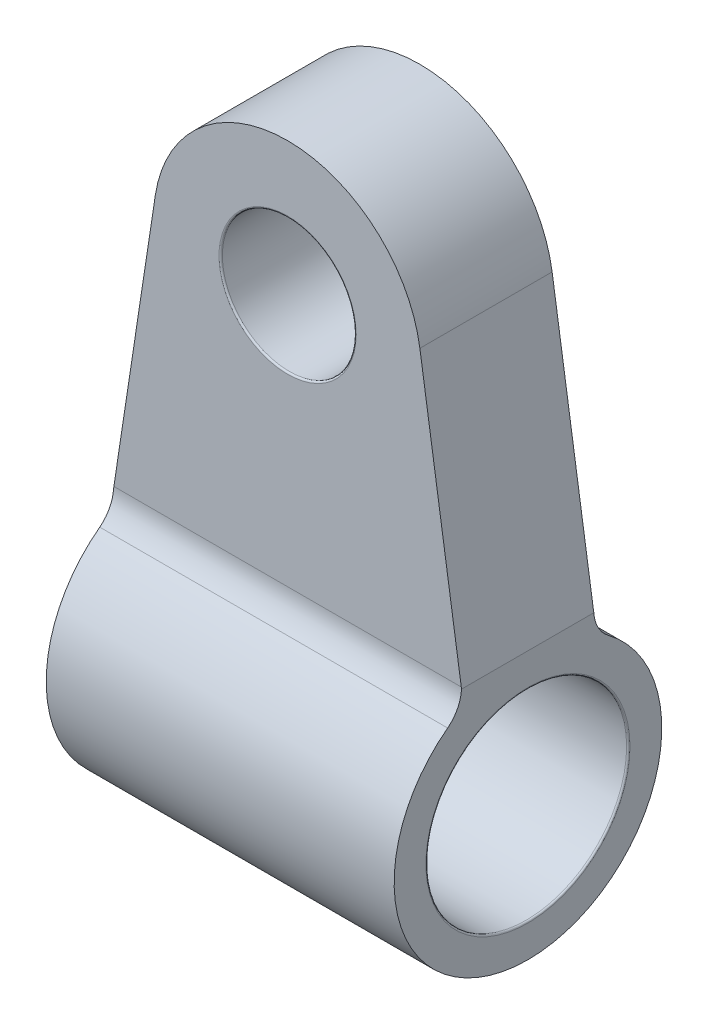
ISO-10303-21;
HEADER;
FILE_DESCRIPTION(('STEP AP214'),'2;1');
FILE_NAME('part.step','',(''),(''),'','','');
FILE_SCHEMA(('AUTOMOTIVE_DESIGN { 1 0 10303 214 1 1 1 1 }'));
ENDSEC;
DATA;
#1=APPLICATION_CONTEXT('core data for automotive mechanical design processes');
#2=APPLICATION_PROTOCOL_DEFINITION('international standard','automotive_design',2000,#1);
#3=PRODUCT_CONTEXT('',#1,'mechanical');
#4=PRODUCT('Part','Part','',(#3));
#5=PRODUCT_RELATED_PRODUCT_CATEGORY('part','',(#4));
#6=PRODUCT_DEFINITION_FORMATION('','',#4);
#7=PRODUCT_DEFINITION_CONTEXT('part definition',#1,'design');
#8=PRODUCT_DEFINITION('design','',#6,#7);
#9=PRODUCT_DEFINITION_SHAPE('','',#8);
#10=(LENGTH_UNIT() NAMED_UNIT(*) SI_UNIT(.MILLI.,.METRE.));
#11=(NAMED_UNIT(*) PLANE_ANGLE_UNIT() SI_UNIT($,.RADIAN.));
#12=(NAMED_UNIT(*) SI_UNIT($,.STERADIAN.) SOLID_ANGLE_UNIT());
#13=UNCERTAINTY_MEASURE_WITH_UNIT(LENGTH_MEASURE(1.E-05),#10,'distance_accuracy_value','');
#14=(GEOMETRIC_REPRESENTATION_CONTEXT(3) GLOBAL_UNCERTAINTY_ASSIGNED_CONTEXT((#13)) GLOBAL_UNIT_ASSIGNED_CONTEXT((#10,
#11,#12)) REPRESENTATION_CONTEXT('',''));
#15=CARTESIAN_POINT('',(0.,0.,0.));
#16=DIRECTION('',(0.,0.,1.));
#17=DIRECTION('',(1.,0.,0.));
#18=AXIS2_PLACEMENT_3D('',#15,#16,#17);
#19=CARTESIAN_POINT('',(26.,0.,0.));
#20=DIRECTION('',(1.,0.,0.));
#21=DIRECTION('',(0.,0.,-1.));
#22=AXIS2_PLACEMENT_3D('',#19,#20,#21);
#23=PLANE('',#22);
#24=CARTESIAN_POINT('',(26.,0.,0.));
#25=DIRECTION('',(1.,0.,0.));
#26=DIRECTION('',(0.,0.,-1.));
#27=AXIS2_PLACEMENT_3D('',#24,#25,#26);
#28=CIRCLE('',#27,15.25);
#29=CARTESIAN_POINT('',(26.,0.,-15.25));
#30=VERTEX_POINT('',#29);
#31=EDGE_CURVE('E40',#30,#30,#28,.F.);
#32=ORIENTED_EDGE('',*,*,#31,.T.);
#33=EDGE_LOOP('',(#32));
#34=FACE_BOUND('',#33,.T.);
#35=CARTESIAN_POINT('',(26.,20.32218793508,-15.24164095131));
#36=DIRECTION('',(1.,0.,0.));
#37=DIRECTION('',(0.,0.,1.));
#38=AXIS2_PLACEMENT_3D('',#35,#36,#37);
#39=CIRCLE('',#38,5.40273491885);
#40=CARTESIAN_POINT('',(26.,20.,-9.84852130329088));
#41=VERTEX_POINT('',#40);
#42=CARTESIAN_POINT('',(26.,16.,-12.));
#43=VERTEX_POINT('',#42);
#44=EDGE_CURVE('E140',#41,#43,#39,.T.);
#45=ORIENTED_EDGE('',*,*,#44,.F.);
#46=DIRECTION('',(0.,0.,1.));
#47=VECTOR('',#46,1.);
#48=CARTESIAN_POINT('',(26.,20.,-26.));
#49=LINE('',#48,#47);
#50=CARTESIAN_POINT('',(26.,20.,9.93385720846343));
#51=VERTEX_POINT('',#50);
#52=EDGE_CURVE('E126',#41,#51,#49,.T.);
#53=ORIENTED_EDGE('',*,*,#52,.T.);
#54=CARTESIAN_POINT('',(26.,20.2540013884046,15.330618079398));
#55=DIRECTION('',(1.,0.,0.));
#56=DIRECTION('',(0.,0.,1.));
#57=AXIS2_PLACEMENT_3D('',#54,#55,#56);
#58=CIRCLE('',#57,5.40273491885);
#59=CARTESIAN_POINT('',(26.,16.,12.));
#60=VERTEX_POINT('',#59);
#61=EDGE_CURVE('E142',#60,#51,#58,.T.);
#62=ORIENTED_EDGE('',*,*,#61,.F.);
#63=CARTESIAN_POINT('',(26.,0.,0.));
#64=DIRECTION('',(1.,0.,0.));
#65=DIRECTION('',(0.,0.,-1.));
#66=AXIS2_PLACEMENT_3D('',#63,#64,#65);
#67=CIRCLE('',#66,20.);
#68=EDGE_CURVE('E55',#60,#43,#67,.T.);
#69=ORIENTED_EDGE('',*,*,#68,.T.);
#70=EDGE_LOOP('',(#45,#53,#62,#69));
#71=FACE_BOUND('',#70,.T.);
#72=ADVANCED_FACE('F32',(#34,#71),#23,.T.);
#73=CARTESIAN_POINT('',(26.,20.32218793508,-15.24164095131));
#74=DIRECTION('',(-1.,0.,0.));
#75=DIRECTION('',(0.,0.,1.));
#76=AXIS2_PLACEMENT_3D('',#73,#74,#75);
#77=CYLINDRICAL_SURFACE('',#76,5.40273491885);
#78=DIRECTION('',(-1.,0.,0.));
#79=VECTOR('',#78,1.);
#80=CARTESIAN_POINT('',(26.,20.2540013884046,-9.83933633214851));
#81=LINE('',#80,#79);
#82=CARTESIAN_POINT('',(25.9614272260813,20.2540013884046,-9.83933633214851));
#83=VERTEX_POINT('',#82);
#84=CARTESIAN_POINT('',(-25.9614272260813,20.2540013884046,-9.83933633214851));
#85=VERTEX_POINT('',#84);
#86=EDGE_CURVE('E150',#83,#85,#81,.T.);
#87=ORIENTED_EDGE('',*,*,#86,.F.);
#88=CARTESIAN_POINT('',(25.9510723840636,20.32218793508,-15.24164095131));
#89=DIRECTION('',(0.988664878704201,0.150139127534453,0.));
#90=DIRECTION('',(-0.150139127534453,0.988664878704201,0.));
#91=AXIS2_PLACEMENT_3D('',#88,#89,#90);
#92=ELLIPSE('',#91,5.46467770346117,5.40273491885);
#93=EDGE_CURVE('E120',#83,#41,#92,.T.);
#94=ORIENTED_EDGE('',*,*,#93,.T.);
#95=ORIENTED_EDGE('',*,*,#44,.T.);
#96=DIRECTION('',(-1.,0.,0.));
#97=VECTOR('',#96,1.);
#98=CARTESIAN_POINT('',(26.,16.,-12.));
#99=LINE('',#98,#97);
#100=CARTESIAN_POINT('',(-26.,16.,-12.));
#101=VERTEX_POINT('',#100);
#102=EDGE_CURVE('E146',#43,#101,#99,.T.);
#103=ORIENTED_EDGE('',*,*,#102,.T.);
#104=CARTESIAN_POINT('',(-26.,20.32218793508,-15.24164095131));
#105=DIRECTION('',(1.,0.,0.));
#106=DIRECTION('',(0.,0.,1.));
#107=AXIS2_PLACEMENT_3D('',#104,#105,#106);
#108=CIRCLE('',#107,5.40273491885);
#109=CARTESIAN_POINT('',(-26.,20.,-9.84852130329088));
#110=VERTEX_POINT('',#109);
#111=EDGE_CURVE('E111',#110,#101,#108,.T.);
#112=ORIENTED_EDGE('',*,*,#111,.F.);
#113=CARTESIAN_POINT('',(-25.9510723840636,20.32218793508,-15.24164095131));
#114=DIRECTION('',(0.988664878704201,-0.150139127534453,0.));
#115=DIRECTION('',(-0.150139127534453,-0.988664878704201,0.));
#116=AXIS2_PLACEMENT_3D('',#113,#114,#115);
#117=ELLIPSE('',#116,5.46467770346117,5.40273491885);
#118=EDGE_CURVE('E112',#85,#110,#117,.T.);
#119=ORIENTED_EDGE('',*,*,#118,.F.);
#120=EDGE_LOOP('',(#87,#94,#95,#103,#112,#119));
#121=FACE_BOUND('',#120,.T.);
#122=ADVANCED_FACE('F211',(#121),#77,.F.);
#123=CARTESIAN_POINT('',(26.,20.2540013884046,-9.83933633214851));
#124=DIRECTION('',(0.,0.,-1.));
#125=DIRECTION('',(0.,1.,0.));
#126=AXIS2_PLACEMENT_3D('',#123,#124,#125);
#127=PLANE('',#126);
#128=CARTESIAN_POINT('',(0.,58.,-9.83933633214851));
#129=DIRECTION('',(0.,0.,-1.));
#130=DIRECTION('',(0.,1.,0.));
#131=AXIS2_PLACEMENT_3D('',#128,#129,#130);
#132=CIRCLE('',#131,10.25);
#133=CARTESIAN_POINT('',(0.,68.25,-9.83933633214851));
#134=VERTEX_POINT('',#133);
#135=EDGE_CURVE('E174',#134,#134,#132,.F.);
#136=ORIENTED_EDGE('',*,*,#135,.T.);
#137=EDGE_LOOP('',(#136));
#138=FACE_BOUND('',#137,.T.);
#139=CARTESIAN_POINT('',(0.,58.,-9.83933633214851));
#140=DIRECTION('',(0.,0.,-1.));
#141=DIRECTION('',(0.,1.,0.));
#142=AXIS2_PLACEMENT_3D('',#139,#140,#141);
#143=CIRCLE('',#142,20.);
#144=CARTESIAN_POINT('',(19.773297574084,61.0027825506891,-9.83933633214852));
#145=VERTEX_POINT('',#144);
#146=CARTESIAN_POINT('',(-19.773297574084,61.0027825506891,-9.83933633214851));
#147=VERTEX_POINT('',#146);
#148=EDGE_CURVE('E100',#145,#147,#143,.F.);
#149=ORIENTED_EDGE('',*,*,#148,.F.);
#150=DIRECTION('',(0.150139127534453,-0.988664878704201,0.));
#151=VECTOR('',#150,1.);
#152=CARTESIAN_POINT('',(25.9622967242016,20.2482757506729,-9.83933633214851));
#153=LINE('',#152,#151);
#154=EDGE_CURVE('E103',#145,#83,#153,.T.);
#155=ORIENTED_EDGE('',*,*,#154,.T.);
#156=ORIENTED_EDGE('',*,*,#86,.T.);
#157=DIRECTION('',(-0.150139127534453,-0.988664878704201,0.));
#158=VECTOR('',#157,1.);
#159=CARTESIAN_POINT('',(-24.7901253281276,27.9670144309283,-9.83933633214851));
#160=LINE('',#159,#158);
#161=EDGE_CURVE('E106',#147,#85,#160,.T.);
#162=ORIENTED_EDGE('',*,*,#161,.F.);
#163=EDGE_LOOP('',(#149,#155,#156,#162));
#164=FACE_BOUND('',#163,.T.);
#165=ADVANCED_FACE('F102',(#138,#164),#127,.T.);
#166=CARTESIAN_POINT('',(26.,78.,9.92788316054795));
#167=DIRECTION('',(0.,0.,1.));
#168=DIRECTION('',(1.,0.,0.));
#169=AXIS2_PLACEMENT_3D('',#166,#167,#168);
#170=PLANE('',#169);
#171=CARTESIAN_POINT('',(0.,58.,9.92788316054795));
#172=DIRECTION('',(0.,0.,1.));
#173=DIRECTION('',(1.,0.,0.));
#174=AXIS2_PLACEMENT_3D('',#171,#172,#173);
#175=CIRCLE('',#174,10.25);
#176=CARTESIAN_POINT('',(10.25,58.,9.92788316054795));
#177=VERTEX_POINT('',#176);
#178=EDGE_CURVE('E11',#177,#177,#175,.F.);
#179=ORIENTED_EDGE('',*,*,#178,.T.);
#180=EDGE_LOOP('',(#179));
#181=FACE_BOUND('',#180,.T.);
#182=DIRECTION('',(-1.,0.,0.));
#183=VECTOR('',#182,1.);
#184=CARTESIAN_POINT('',(26.,20.2540013884046,9.92788316054795));
#185=LINE('',#184,#183);
#186=CARTESIAN_POINT('',(25.9614272260813,20.2540013884046,9.92788316054795));
#187=VERTEX_POINT('',#186);
#188=CARTESIAN_POINT('',(-25.9614272260813,20.2540013884046,9.92788316054795));
#189=VERTEX_POINT('',#188);
#190=EDGE_CURVE('E153',#187,#189,#185,.T.);
#191=ORIENTED_EDGE('',*,*,#190,.F.);
#192=DIRECTION('',(-0.150139127534453,0.988664878704201,0.));
#193=VECTOR('',#192,1.);
#194=CARTESIAN_POINT('',(17.3906376258689,76.6925780582252,9.92788316054795));
#195=LINE('',#194,#193);
#196=CARTESIAN_POINT('',(19.773297574084,61.0027825506891,9.92788316054794));
#197=VERTEX_POINT('',#196);
#198=EDGE_CURVE('E121',#187,#197,#195,.T.);
#199=ORIENTED_EDGE('',*,*,#198,.T.);
#200=CARTESIAN_POINT('',(0.,58.,9.92788316054795));
#201=DIRECTION('',(0.,0.,1.));
#202=DIRECTION('',(1.,0.,0.));
#203=AXIS2_PLACEMENT_3D('',#200,#201,#202);
#204=CIRCLE('',#203,20.);
#205=CARTESIAN_POINT('',(-19.773297574084,61.0027825506891,9.92788316054794));
#206=VERTEX_POINT('',#205);
#207=EDGE_CURVE('E125',#206,#197,#204,.F.);
#208=ORIENTED_EDGE('',*,*,#207,.F.);
#209=DIRECTION('',(0.150139127534453,0.988664878704201,0.));
#210=VECTOR('',#209,1.);
#211=CARTESIAN_POINT('',(-16.2184662297949,84.4113167384807,9.92788316054795));
#212=LINE('',#211,#210);
#213=EDGE_CURVE('E135',#189,#206,#212,.T.);
#214=ORIENTED_EDGE('',*,*,#213,.F.);
#215=EDGE_LOOP('',(#191,#199,#208,#214));
#216=FACE_BOUND('',#215,.T.);
#217=ADVANCED_FACE('F244',(#181,#216),#170,.T.);
#218=CARTESIAN_POINT('',(26.,20.2540013884046,15.330618079398));
#219=DIRECTION('',(-1.,0.,0.));
#220=DIRECTION('',(0.,0.,1.));
#221=AXIS2_PLACEMENT_3D('',#218,#219,#220);
#222=CYLINDRICAL_SURFACE('',#221,5.40273491885);
#223=ORIENTED_EDGE('',*,*,#61,.T.);
#224=CARTESIAN_POINT('',(25.9614272260813,20.2540013884046,15.330618079398));
#225=DIRECTION('',(0.988664878704201,0.150139127534453,0.));
#226=DIRECTION('',(-0.150139127534453,0.988664878704201,0.));
#227=AXIS2_PLACEMENT_3D('',#224,#225,#226);
#228=ELLIPSE('',#227,5.46467770346117,5.40273491885);
#229=EDGE_CURVE('E165',#51,#187,#228,.T.);
#230=ORIENTED_EDGE('',*,*,#229,.T.);
#231=ORIENTED_EDGE('',*,*,#190,.T.);
#232=CARTESIAN_POINT('',(-25.9614272260813,20.2540013884046,15.330618079398));
#233=DIRECTION('',(0.988664878704201,-0.150139127534453,0.));
#234=DIRECTION('',(-0.150139127534453,-0.988664878704201,0.));
#235=AXIS2_PLACEMENT_3D('',#232,#233,#234);
#236=ELLIPSE('',#235,5.46467770346117,5.40273491885);
#237=CARTESIAN_POINT('',(-26.,19.9999999999998,9.93385720846347));
#238=VERTEX_POINT('',#237);
#239=EDGE_CURVE('E160',#238,#189,#236,.T.);
#240=ORIENTED_EDGE('',*,*,#239,.F.);
#241=CARTESIAN_POINT('',(-26.,20.2540013884046,15.330618079398));
#242=DIRECTION('',(1.,0.,0.));
#243=DIRECTION('',(0.,0.,1.));
#244=AXIS2_PLACEMENT_3D('',#241,#242,#243);
#245=CIRCLE('',#244,5.40273491885);
#246=CARTESIAN_POINT('',(-26.,16.,12.));
#247=VERTEX_POINT('',#246);
#248=EDGE_CURVE('E143',#247,#238,#245,.T.);
#249=ORIENTED_EDGE('',*,*,#248,.F.);
#250=DIRECTION('',(-1.,0.,0.));
#251=VECTOR('',#250,1.);
#252=CARTESIAN_POINT('',(26.,16.,12.));
#253=LINE('',#252,#251);
#254=EDGE_CURVE('E155',#60,#247,#253,.T.);
#255=ORIENTED_EDGE('',*,*,#254,.F.);
#256=EDGE_LOOP('',(#223,#230,#231,#240,#249,#255));
#257=FACE_BOUND('',#256,.T.);
#258=ADVANCED_FACE('F226',(#257),#222,.F.);
#259=CARTESIAN_POINT('',(26.,0.,0.));
#260=DIRECTION('',(-1.,0.,0.));
#261=DIRECTION('',(0.,0.,1.));
#262=AXIS2_PLACEMENT_3D('',#259,#260,#261);
#263=CYLINDRICAL_SURFACE('',#262,20.);
#264=ORIENTED_EDGE('',*,*,#102,.F.);
#265=ORIENTED_EDGE('',*,*,#68,.F.);
#266=ORIENTED_EDGE('',*,*,#254,.T.);
#267=CARTESIAN_POINT('',(-26.,0.,0.));
#268=DIRECTION('',(1.,0.,0.));
#269=DIRECTION('',(0.,0.,-1.));
#270=AXIS2_PLACEMENT_3D('',#267,#268,#269);
#271=CIRCLE('',#270,20.);
#272=EDGE_CURVE('E152',#247,#101,#271,.T.);
#273=ORIENTED_EDGE('',*,*,#272,.T.);
#274=EDGE_LOOP('',(#264,#265,#266,#273));
#275=FACE_BOUND('',#274,.T.);
#276=ADVANCED_FACE('F223',(#275),#263,.T.);
#277=CARTESIAN_POINT('',(-26.,0.,0.));
#278=DIRECTION('',(1.,0.,0.));
#279=DIRECTION('',(0.,0.,-1.));
#280=AXIS2_PLACEMENT_3D('',#277,#278,#279);
#281=PLANE('',#280);
#282=CARTESIAN_POINT('',(-26.,0.,0.));
#283=DIRECTION('',(1.,0.,0.));
#284=DIRECTION('',(0.,0.,-1.));
#285=AXIS2_PLACEMENT_3D('',#282,#283,#284);
#286=CIRCLE('',#285,15.25);
#287=CARTESIAN_POINT('',(-26.,0.,-15.25));
#288=VERTEX_POINT('',#287);
#289=EDGE_CURVE('E177',#288,#288,#286,.T.);
#290=ORIENTED_EDGE('',*,*,#289,.T.);
#291=EDGE_LOOP('',(#290));
#292=FACE_BOUND('',#291,.T.);
#293=ORIENTED_EDGE('',*,*,#248,.T.);
#294=DIRECTION('',(0.,0.,1.));
#295=VECTOR('',#294,1.);
#296=CARTESIAN_POINT('',(-26.,20.,-26.));
#297=LINE('',#296,#295);
#298=EDGE_CURVE('E47',#110,#238,#297,.T.);
#299=ORIENTED_EDGE('',*,*,#298,.F.);
#300=ORIENTED_EDGE('',*,*,#111,.T.);
#301=ORIENTED_EDGE('',*,*,#272,.F.);
#302=EDGE_LOOP('',(#293,#299,#300,#301));
#303=FACE_BOUND('',#302,.T.);
#304=ADVANCED_FACE('F220',(#292,#303),#281,.F.);
#305=CARTESIAN_POINT('',(0.,58.,-26.));
#306=DIRECTION('',(0.,0.,1.));
#307=DIRECTION('',(1.,0.,0.));
#308=AXIS2_PLACEMENT_3D('',#305,#306,#307);
#309=CYLINDRICAL_SURFACE('',#308,20.);
#310=ORIENTED_EDGE('',*,*,#148,.T.);
#311=DIRECTION('',(0.,0.,1.));
#312=VECTOR('',#311,1.);
#313=CARTESIAN_POINT('',(-19.773297574084,61.0027825506891,-26.));
#314=LINE('',#313,#312);
#315=EDGE_CURVE('E133',#147,#206,#314,.T.);
#316=ORIENTED_EDGE('',*,*,#315,.T.);
#317=ORIENTED_EDGE('',*,*,#207,.T.);
#318=DIRECTION('',(0.,0.,1.));
#319=VECTOR('',#318,1.);
#320=CARTESIAN_POINT('',(19.773297574084,61.0027825506891,-26.));
#321=LINE('',#320,#319);
#322=EDGE_CURVE('E117',#145,#197,#321,.T.);
#323=ORIENTED_EDGE('',*,*,#322,.F.);
#324=EDGE_LOOP('',(#310,#316,#317,#323));
#325=FACE_BOUND('',#324,.T.);
#326=ADVANCED_FACE('F123',(#325),#309,.T.);
#327=CARTESIAN_POINT('',(-26.,20.,-26.));
#328=DIRECTION('',(0.988664878704201,-0.150139127534453,0.));
#329=DIRECTION('',(0.150139127534453,0.988664878704201,0.));
#330=AXIS2_PLACEMENT_3D('',#327,#328,#329);
#331=PLANE('',#330);
#332=ORIENTED_EDGE('',*,*,#118,.T.);
#333=ORIENTED_EDGE('',*,*,#298,.T.);
#334=ORIENTED_EDGE('',*,*,#239,.T.);
#335=ORIENTED_EDGE('',*,*,#213,.T.);
#336=ORIENTED_EDGE('',*,*,#315,.F.);
#337=ORIENTED_EDGE('',*,*,#161,.T.);
#338=EDGE_LOOP('',(#332,#333,#334,#335,#336,#337));
#339=FACE_BOUND('',#338,.T.);
#340=ADVANCED_FACE('F242',(#339),#331,.F.);
#341=CARTESIAN_POINT('',(26.,20.,-26.));
#342=DIRECTION('',(0.988664878704201,0.150139127534453,0.));
#343=DIRECTION('',(-0.150139127534453,0.988664878704201,0.));
#344=AXIS2_PLACEMENT_3D('',#341,#342,#343);
#345=PLANE('',#344);
#346=ORIENTED_EDGE('',*,*,#154,.F.);
#347=ORIENTED_EDGE('',*,*,#322,.T.);
#348=ORIENTED_EDGE('',*,*,#198,.F.);
#349=ORIENTED_EDGE('',*,*,#229,.F.);
#350=ORIENTED_EDGE('',*,*,#52,.F.);
#351=ORIENTED_EDGE('',*,*,#93,.F.);
#352=EDGE_LOOP('',(#346,#347,#348,#349,#350,#351));
#353=FACE_BOUND('',#352,.T.);
#354=ADVANCED_FACE('F116',(#353),#345,.T.);
#355=CARTESIAN_POINT('',(0.,58.,-42.072116839452));
#356=DIRECTION('',(0.,0.,1.));
#357=DIRECTION('',(1.,0.,0.));
#358=AXIS2_PLACEMENT_3D('',#355,#356,#357);
#359=CYLINDRICAL_SURFACE('',#358,10.);
#360=CARTESIAN_POINT('',(0.,58.,-9.58933633214852));
#361=DIRECTION('',(0.,0.,-1.));
#362=DIRECTION('',(0.,1.,0.));
#363=AXIS2_PLACEMENT_3D('',#360,#361,#362);
#364=CIRCLE('',#363,10.);
#365=CARTESIAN_POINT('',(10.,58.,-9.58933633214851));
#366=VERTEX_POINT('',#365);
#367=EDGE_CURVE('E171',#366,#366,#364,.T.);
#368=CARTESIAN_POINT('',(0.,58.,9.67788316054795));
#369=DIRECTION('',(0.,0.,1.));
#370=DIRECTION('',(1.,0.,0.));
#371=AXIS2_PLACEMENT_3D('',#368,#369,#370);
#372=CIRCLE('',#371,10.);
#373=CARTESIAN_POINT('',(10.,58.,9.67788316054795));
#374=VERTEX_POINT('',#373);
#375=EDGE_CURVE('E168',#374,#374,#372,.T.);
#376=CARTESIAN_POINT('',(10.,58.,-9.58933633214851));
#377=CARTESIAN_POINT('',(10.,58.,-9.38863612909959));
#378=CARTESIAN_POINT('',(10.,58.,-9.18793592605067));
#379=CARTESIAN_POINT('',(10.,58.,-8.78653551995283));
#380=CARTESIAN_POINT('',(10.,58.,-8.58583531690391));
#381=CARTESIAN_POINT('',(10.,58.,-8.18443491080606));
#382=CARTESIAN_POINT('',(10.,58.,-7.98373470775714));
#383=CARTESIAN_POINT('',(10.,58.,-7.5823343016593));
#384=CARTESIAN_POINT('',(10.,58.,-7.38163409861038));
#385=CARTESIAN_POINT('',(10.,58.,-6.98023369251253));
#386=CARTESIAN_POINT('',(10.,58.,-6.77953348946361));
#387=CARTESIAN_POINT('',(10.,58.,-6.37813308336577));
#388=CARTESIAN_POINT('',(10.,58.,-6.17743288031685));
#389=CARTESIAN_POINT('',(10.,58.,-5.776032474219));
#390=CARTESIAN_POINT('',(10.,58.,-5.57533227117008));
#391=CARTESIAN_POINT('',(10.,58.,-5.17393186507224));
#392=CARTESIAN_POINT('',(10.,58.,-4.97323166202332));
#393=CARTESIAN_POINT('',(10.,58.,-4.57183125592548));
#394=CARTESIAN_POINT('',(10.,58.,-4.37113105287655));
#395=CARTESIAN_POINT('',(10.,58.,-3.96973064677871));
#396=CARTESIAN_POINT('',(10.,58.,-3.76903044372979));
#397=CARTESIAN_POINT('',(10.,58.,-3.36763003763194));
#398=CARTESIAN_POINT('',(10.,58.,-3.16692983458302));
#399=CARTESIAN_POINT('',(10.,58.,-2.76552942848518));
#400=CARTESIAN_POINT('',(10.,58.,-2.56482922543626));
#401=CARTESIAN_POINT('',(10.,58.,-2.16342881933842));
#402=CARTESIAN_POINT('',(10.,58.,-1.9627286162895));
#403=CARTESIAN_POINT('',(10.,58.,-1.56132821019165));
#404=CARTESIAN_POINT('',(10.,58.,-1.36062800714273));
#405=CARTESIAN_POINT('',(10.,58.,-0.95922760104489));
#406=CARTESIAN_POINT('',(10.,58.,-0.758527397995969));
#407=CARTESIAN_POINT('',(10.,58.,-0.357126991898125));
#408=CARTESIAN_POINT('',(10.,58.,-0.156426788849202));
#409=CARTESIAN_POINT('',(10.,58.,0.244973617248644));
#410=CARTESIAN_POINT('',(10.,58.,0.445673820297567));
#411=CARTESIAN_POINT('',(10.,58.,0.84707422639541));
#412=CARTESIAN_POINT('',(10.,58.,1.04777442944433));
#413=CARTESIAN_POINT('',(10.,58.,1.44917483554217));
#414=CARTESIAN_POINT('',(10.,58.,1.64987503859109));
#415=CARTESIAN_POINT('',(10.,58.,2.05127544468894));
#416=CARTESIAN_POINT('',(10.,58.,2.25197564773786));
#417=CARTESIAN_POINT('',(10.,58.,2.6533760538357));
#418=CARTESIAN_POINT('',(10.,58.,2.85407625688462));
#419=CARTESIAN_POINT('',(10.,58.,3.25547666298247));
#420=CARTESIAN_POINT('',(10.,58.,3.45617686603139));
#421=CARTESIAN_POINT('',(10.,58.,3.85757727212923));
#422=CARTESIAN_POINT('',(10.,58.,4.05827747517815));
#423=CARTESIAN_POINT('',(10.,58.,4.459677881276));
#424=CARTESIAN_POINT('',(10.,58.,4.66037808432492));
#425=CARTESIAN_POINT('',(10.,58.,5.06177849042276));
#426=CARTESIAN_POINT('',(10.,58.,5.26247869347168));
#427=CARTESIAN_POINT('',(10.,58.,5.66387909956952));
#428=CARTESIAN_POINT('',(10.,58.,5.86457930261845));
#429=CARTESIAN_POINT('',(10.,58.,6.26597970871629));
#430=CARTESIAN_POINT('',(10.,58.,6.46667991176521));
#431=CARTESIAN_POINT('',(10.,58.,6.86808031786305));
#432=CARTESIAN_POINT('',(10.,58.,7.06878052091197));
#433=CARTESIAN_POINT('',(10.,58.,7.47018092700982));
#434=CARTESIAN_POINT('',(10.,58.,7.67088113005874));
#435=CARTESIAN_POINT('',(10.,58.,8.07228153615658));
#436=CARTESIAN_POINT('',(10.,58.,8.2729817392055));
#437=CARTESIAN_POINT('',(10.,58.,8.67438214530335));
#438=CARTESIAN_POINT('',(10.,58.,8.87508234835227));
#439=CARTESIAN_POINT('',(10.,58.,9.27648275445011));
#440=CARTESIAN_POINT('',(10.,58.,9.47718295749903));
#441=CARTESIAN_POINT('',(10.,58.,9.67788316054795));
#442=B_SPLINE_CURVE_WITH_KNOTS('',3,(#376,#377,#378,#379,#380,#381,#382,#383,#384,#385,#386,
#387,#388,#389,#390,#391,#392,#393,#394,#395,#396,#397,#398,#399,#400,#401,#402,#403,#404,#405,
#406,#407,#408,#409,#410,#411,#412,#413,#414,#415,#416,#417,#418,#419,#420,#421,#422,#423,#424,
#425,#426,#427,#428,#429,#430,#431,#432,#433,#434,#435,#436,#437,#438,#439,#440,#441),
.UNSPECIFIED.,.F.,.F.,(4,2,2,2,2,2,2,2,2,2,2,2,2,2,2,2,2,2,2,2,2,2,2,2,2,2,2,2,2,2,2,2,4),(0.,
0.602100609146762,1.20420121829353,1.80630182744029,2.40840243658706,3.01050304573382,
3.61260365488059,4.21470426402735,4.81680487317412,5.41890548232088,6.02100609146765,
6.62310670061441,7.22520730976117,7.82730791890794,8.4294085280547,9.03150913720147,
9.63360974634823,10.235710355495,10.8378109646418,11.4399115737885,12.0420121829353,
12.6441127920821,13.2462134012288,13.8483140103756,14.4504146195224,15.0525152286691,
15.6546158378159,16.2567164469626,16.8588170561094,17.4609176652562,18.0630182744029,
18.6651188835497,19.2672194926965),.UNSPECIFIED.);
#443=EDGE_CURVE('BSEAM199',#366,#374,#442,.T.);
#444=ORIENTED_EDGE('',*,*,#367,.T.);
#445=ORIENTED_EDGE('',*,*,#375,.T.);
#446=ORIENTED_EDGE('',*,*,#443,.T.);
#447=ORIENTED_EDGE('',*,*,#443,.F.);
#448=EDGE_LOOP('',(#444,#446,#445,#447));
#449=FACE_BOUND('',#448,.T.);
#450=ADVANCED_FACE('F199',(#449),#359,.F.);
#451=CARTESIAN_POINT('',(-26.,0.,0.));
#452=DIRECTION('',(1.,0.,0.));
#453=DIRECTION('',(0.,0.,-1.));
#454=AXIS2_PLACEMENT_3D('',#451,#452,#453);
#455=CYLINDRICAL_SURFACE('',#454,15.);
#456=CARTESIAN_POINT('',(-25.75,0.,0.));
#457=DIRECTION('',(1.,0.,0.));
#458=DIRECTION('',(0.,0.,-1.));
#459=AXIS2_PLACEMENT_3D('',#456,#457,#458);
#460=CIRCLE('',#459,15.);
#461=CARTESIAN_POINT('',(-25.75,0.,-15.));
#462=VERTEX_POINT('',#461);
#463=EDGE_CURVE('E183',#462,#462,#460,.F.);
#464=CARTESIAN_POINT('',(25.75,0.,0.));
#465=DIRECTION('',(1.,0.,0.));
#466=DIRECTION('',(0.,0.,-1.));
#467=AXIS2_PLACEMENT_3D('',#464,#465,#466);
#468=CIRCLE('',#467,15.);
#469=CARTESIAN_POINT('',(25.75,0.,-15.));
#470=VERTEX_POINT('',#469);
#471=EDGE_CURVE('E180',#470,#470,#468,.T.);
#472=CARTESIAN_POINT('',(-25.75,0.,-15.));
#473=CARTESIAN_POINT('',(-25.2135416666667,0.,-15.));
#474=CARTESIAN_POINT('',(-24.6770833333333,0.,-15.));
#475=CARTESIAN_POINT('',(-23.6041666666667,0.,-15.));
#476=CARTESIAN_POINT('',(-23.0677083333333,0.,-15.));
#477=CARTESIAN_POINT('',(-21.9947916666667,0.,-15.));
#478=CARTESIAN_POINT('',(-21.4583333333333,0.,-15.));
#479=CARTESIAN_POINT('',(-20.3854166666667,0.,-15.));
#480=CARTESIAN_POINT('',(-19.8489583333333,0.,-15.));
#481=CARTESIAN_POINT('',(-18.7760416666667,0.,-15.));
#482=CARTESIAN_POINT('',(-18.2395833333333,0.,-15.));
#483=CARTESIAN_POINT('',(-17.1666666666667,0.,-15.));
#484=CARTESIAN_POINT('',(-16.6302083333333,0.,-15.));
#485=CARTESIAN_POINT('',(-15.5572916666667,0.,-15.));
#486=CARTESIAN_POINT('',(-15.0208333333333,0.,-15.));
#487=CARTESIAN_POINT('',(-13.9479166666667,0.,-15.));
#488=CARTESIAN_POINT('',(-13.4114583333333,0.,-15.));
#489=CARTESIAN_POINT('',(-12.3385416666667,0.,-15.));
#490=CARTESIAN_POINT('',(-11.8020833333333,0.,-15.));
#491=CARTESIAN_POINT('',(-10.7291666666667,0.,-15.));
#492=CARTESIAN_POINT('',(-10.1927083333333,0.,-15.));
#493=CARTESIAN_POINT('',(-9.11979166666667,0.,-15.));
#494=CARTESIAN_POINT('',(-8.58333333333334,0.,-15.));
#495=CARTESIAN_POINT('',(-7.51041666666667,0.,-15.));
#496=CARTESIAN_POINT('',(-6.97395833333333,0.,-15.));
#497=CARTESIAN_POINT('',(-5.90104166666667,0.,-15.));
#498=CARTESIAN_POINT('',(-5.36458333333333,0.,-15.));
#499=CARTESIAN_POINT('',(-4.29166666666667,0.,-15.));
#500=CARTESIAN_POINT('',(-3.75520833333333,0.,-15.));
#501=CARTESIAN_POINT('',(-2.68229166666667,0.,-15.));
#502=CARTESIAN_POINT('',(-2.14583333333333,0.,-15.));
#503=CARTESIAN_POINT('',(-1.07291666666667,0.,-15.));
#504=CARTESIAN_POINT('',(-0.536458333333333,0.,-15.));
#505=CARTESIAN_POINT('',(0.536458333333333,0.,-15.));
#506=CARTESIAN_POINT('',(1.07291666666667,0.,-15.));
#507=CARTESIAN_POINT('',(2.14583333333333,0.,-15.));
#508=CARTESIAN_POINT('',(2.68229166666667,0.,-15.));
#509=CARTESIAN_POINT('',(3.75520833333333,0.,-15.));
#510=CARTESIAN_POINT('',(4.29166666666667,0.,-15.));
#511=CARTESIAN_POINT('',(5.36458333333333,0.,-15.));
#512=CARTESIAN_POINT('',(5.90104166666666,0.,-15.));
#513=CARTESIAN_POINT('',(6.97395833333333,0.,-15.));
#514=CARTESIAN_POINT('',(7.51041666666666,0.,-15.));
#515=CARTESIAN_POINT('',(8.58333333333333,0.,-15.));
#516=CARTESIAN_POINT('',(9.11979166666666,0.,-15.));
#517=CARTESIAN_POINT('',(10.1927083333333,0.,-15.));
#518=CARTESIAN_POINT('',(10.7291666666667,0.,-15.));
#519=CARTESIAN_POINT('',(11.8020833333333,0.,-15.));
#520=CARTESIAN_POINT('',(12.3385416666667,0.,-15.));
#521=CARTESIAN_POINT('',(13.4114583333333,0.,-15.));
#522=CARTESIAN_POINT('',(13.9479166666667,0.,-15.));
#523=CARTESIAN_POINT('',(15.0208333333333,0.,-15.));
#524=CARTESIAN_POINT('',(15.5572916666667,0.,-15.));
#525=CARTESIAN_POINT('',(16.6302083333333,0.,-15.));
#526=CARTESIAN_POINT('',(17.1666666666667,0.,-15.));
#527=CARTESIAN_POINT('',(18.2395833333333,0.,-15.));
#528=CARTESIAN_POINT('',(18.7760416666667,0.,-15.));
#529=CARTESIAN_POINT('',(19.8489583333333,0.,-15.));
#530=CARTESIAN_POINT('',(20.3854166666667,0.,-15.));
#531=CARTESIAN_POINT('',(21.4583333333333,0.,-15.));
#532=CARTESIAN_POINT('',(21.9947916666667,0.,-15.));
#533=CARTESIAN_POINT('',(23.0677083333333,0.,-15.));
#534=CARTESIAN_POINT('',(23.6041666666667,0.,-15.));
#535=CARTESIAN_POINT('',(24.6770833333333,0.,-15.));
#536=CARTESIAN_POINT('',(25.2135416666667,0.,-15.));
#537=CARTESIAN_POINT('',(25.75,0.,-15.));
#538=B_SPLINE_CURVE_WITH_KNOTS('',3,(#472,#473,#474,#475,#476,#477,#478,#479,#480,#481,#482,
#483,#484,#485,#486,#487,#488,#489,#490,#491,#492,#493,#494,#495,#496,#497,#498,#499,#500,#501,
#502,#503,#504,#505,#506,#507,#508,#509,#510,#511,#512,#513,#514,#515,#516,#517,#518,#519,#520,
#521,#522,#523,#524,#525,#526,#527,#528,#529,#530,#531,#532,#533,#534,#535,#536,#537),
.UNSPECIFIED.,.F.,.F.,(4,2,2,2,2,2,2,2,2,2,2,2,2,2,2,2,2,2,2,2,2,2,2,2,2,2,2,2,2,2,2,2,4),(0.,
1.609375,3.21875,4.828125,6.4375,8.046875,9.65625,11.265625,12.875,14.484375,16.09375,17.703125,
19.3125,20.921875,22.53125,24.140625,25.75,27.359375,28.96875,30.578125,32.1875,33.796875,
35.40625,37.015625,38.625,40.234375,41.84375,43.453125,45.0625,46.671875,48.28125,49.890625,
51.5),.UNSPECIFIED.);
#539=EDGE_CURVE('BSEAM196',#462,#470,#538,.T.);
#540=ORIENTED_EDGE('',*,*,#463,.T.);
#541=ORIENTED_EDGE('',*,*,#471,.T.);
#542=ORIENTED_EDGE('',*,*,#539,.T.);
#543=ORIENTED_EDGE('',*,*,#539,.F.);
#544=EDGE_LOOP('',(#540,#542,#541,#543));
#545=FACE_BOUND('',#544,.T.);
#546=ADVANCED_FACE('F196',(#545),#455,.F.);
#547=CARTESIAN_POINT('',(0.,58.,-9.58933633214851));
#548=DIRECTION('',(0.,0.,-1.));
#549=DIRECTION('',(0.,1.,0.));
#550=AXIS2_PLACEMENT_3D('',#547,#548,#549);
#551=TOROIDAL_SURFACE('',#550,10.25,0.25);
#552=ORIENTED_EDGE('',*,*,#135,.F.);
#553=EDGE_LOOP('',(#552));
#554=FACE_BOUND('',#553,.T.);
#555=ORIENTED_EDGE('',*,*,#367,.F.);
#556=EDGE_LOOP('',(#555));
#557=FACE_BOUND('',#556,.T.);
#558=ADVANCED_FACE('F198',(#554,#557),#551,.T.);
#559=CARTESIAN_POINT('',(-25.75,0.,0.));
#560=DIRECTION('',(1.,0.,0.));
#561=DIRECTION('',(0.,0.,-1.));
#562=AXIS2_PLACEMENT_3D('',#559,#560,#561);
#563=TOROIDAL_SURFACE('',#562,15.25,0.25);
#564=ORIENTED_EDGE('',*,*,#463,.F.);
#565=EDGE_LOOP('',(#564));
#566=FACE_BOUND('',#565,.T.);
#567=ORIENTED_EDGE('',*,*,#289,.F.);
#568=EDGE_LOOP('',(#567));
#569=FACE_BOUND('',#568,.T.);
#570=ADVANCED_FACE('F193',(#566,#569),#563,.T.);
#571=CARTESIAN_POINT('',(25.75,0.,0.));
#572=DIRECTION('',(1.,0.,0.));
#573=DIRECTION('',(0.,0.,-1.));
#574=AXIS2_PLACEMENT_3D('',#571,#572,#573);
#575=TOROIDAL_SURFACE('',#574,15.25,0.25);
#576=ORIENTED_EDGE('',*,*,#31,.F.);
#577=EDGE_LOOP('',(#576));
#578=FACE_BOUND('',#577,.T.);
#579=ORIENTED_EDGE('',*,*,#471,.F.);
#580=EDGE_LOOP('',(#579));
#581=FACE_BOUND('',#580,.T.);
#582=ADVANCED_FACE('F190',(#578,#581),#575,.T.);
#583=CARTESIAN_POINT('',(0.,58.,9.67788316054795));
#584=DIRECTION('',(0.,0.,1.));
#585=DIRECTION('',(1.,0.,0.));
#586=AXIS2_PLACEMENT_3D('',#583,#584,#585);
#587=TOROIDAL_SURFACE('',#586,10.25,0.25);
#588=ORIENTED_EDGE('',*,*,#178,.F.);
#589=EDGE_LOOP('',(#588));
#590=FACE_BOUND('',#589,.T.);
#591=ORIENTED_EDGE('',*,*,#375,.F.);
#592=EDGE_LOOP('',(#591));
#593=FACE_BOUND('',#592,.T.);
#594=ADVANCED_FACE('F34',(#590,#593),#587,.T.);
#595=CLOSED_SHELL('',(#72,#122,#165,#217,#258,#276,#304,#326,#340,#354,#450,#546,#558,#570,#582,#594));
#596=MANIFOLD_SOLID_BREP('B2',#595);
#597=ADVANCED_BREP_SHAPE_REPRESENTATION('',(#18,#596),#14);
#598=SHAPE_DEFINITION_REPRESENTATION(#9,#597);
ENDSEC;
END-ISO-10303-21;
